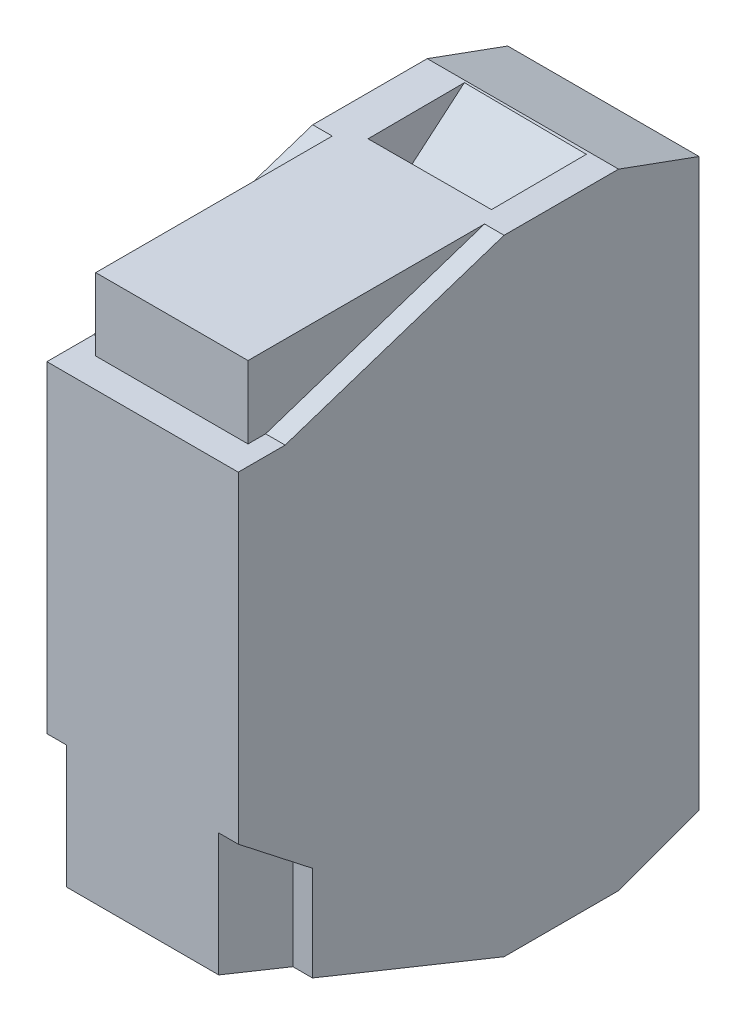
ISO-10303-21;
HEADER;
FILE_DESCRIPTION(('STEP AP214'),'2;1');
FILE_NAME('part.step','',(''),(''),'','','');
FILE_SCHEMA(('AUTOMOTIVE_DESIGN { 1 0 10303 214 1 1 1 1 }'));
ENDSEC;
DATA;
#1=APPLICATION_CONTEXT('core data for automotive mechanical design processes');
#2=APPLICATION_PROTOCOL_DEFINITION('international standard','automotive_design',2000,#1);
#3=PRODUCT_CONTEXT('',#1,'mechanical');
#4=PRODUCT('Part','Part','',(#3));
#5=PRODUCT_RELATED_PRODUCT_CATEGORY('part','',(#4));
#6=PRODUCT_DEFINITION_FORMATION('','',#4);
#7=PRODUCT_DEFINITION_CONTEXT('part definition',#1,'design');
#8=PRODUCT_DEFINITION('design','',#6,#7);
#9=PRODUCT_DEFINITION_SHAPE('','',#8);
#10=(LENGTH_UNIT() NAMED_UNIT(*) SI_UNIT(.MILLI.,.METRE.));
#11=(NAMED_UNIT(*) PLANE_ANGLE_UNIT() SI_UNIT($,.RADIAN.));
#12=(NAMED_UNIT(*) SI_UNIT($,.STERADIAN.) SOLID_ANGLE_UNIT());
#13=UNCERTAINTY_MEASURE_WITH_UNIT(LENGTH_MEASURE(1.E-05),#10,'distance_accuracy_value','');
#14=(GEOMETRIC_REPRESENTATION_CONTEXT(3) GLOBAL_UNCERTAINTY_ASSIGNED_CONTEXT((#13)) GLOBAL_UNIT_ASSIGNED_CONTEXT((#10,
#11,#12)) REPRESENTATION_CONTEXT('',''));
#15=CARTESIAN_POINT('',(0.,0.,0.));
#16=DIRECTION('',(0.,0.,1.));
#17=DIRECTION('',(1.,0.,0.));
#18=AXIS2_PLACEMENT_3D('',#15,#16,#17);
#19=CARTESIAN_POINT('',(-12.775,-14.5187608579998,-13.9946766695134));
#20=DIRECTION('',(0.0158897882345265,0.952019244493626,0.305625379743972));
#21=DIRECTION('',(0.,-0.3056639700203,0.952139452722882));
#22=AXIS2_PLACEMENT_3D('',#19,#20,#21);
#23=PLANE('',#22);
#24=DIRECTION('',(0.,0.305663970020264,-0.952139452722894));
#25=VECTOR('',#24,1.);
#26=CARTESIAN_POINT('',(-12.775,-14.5187608579998,-13.9946766695134));
#27=LINE('',#26,#25);
#28=CARTESIAN_POINT('',(-12.775,-14.5187608579998,-13.9946766695134));
#29=VERTEX_POINT('',#28);
#30=CARTESIAN_POINT('',(-12.775,-13.7192143055118,-16.485254204255));
#31=VERTEX_POINT('',#30);
#32=EDGE_CURVE('E252',#29,#31,#27,.T.);
#33=ORIENTED_EDGE('',*,*,#32,.T.);
#34=DIRECTION('',(0.999873749345317,-0.0151292942734967,-0.00485693575454399));
#35=VECTOR('',#34,1.);
#36=CARTESIAN_POINT('',(-12.775,-13.7192143055118,-16.485254204255));
#37=LINE('',#36,#35);
#38=CARTESIAN_POINT('',(-6.475,-13.8145408944791,-16.5158567631017));
#39=VERTEX_POINT('',#38);
#40=EDGE_CURVE('E267',#31,#39,#37,.T.);
#41=ORIENTED_EDGE('',*,*,#40,.T.);
#42=DIRECTION('',(0.,-0.305663970020309,0.952139452722879));
#43=VECTOR('',#42,1.);
#44=CARTESIAN_POINT('',(-6.475,-13.8145408944791,-16.5158567631017));
#45=LINE('',#44,#43);
#46=CARTESIAN_POINT('',(-6.475,-14.6140874469672,-14.0252792283602));
#47=VERTEX_POINT('',#46);
#48=EDGE_CURVE('E272',#39,#47,#45,.T.);
#49=ORIENTED_EDGE('',*,*,#48,.T.);
#50=DIRECTION('',(-0.999873749345317,0.0151292942735146,0.00485693575454812));
#51=VECTOR('',#50,1.);
#52=CARTESIAN_POINT('',(-6.475,-14.6140874469672,-14.0252792283601));
#53=LINE('',#52,#51);
#54=EDGE_CURVE('E192',#47,#29,#53,.T.);
#55=ORIENTED_EDGE('',*,*,#54,.T.);
#56=EDGE_LOOP('',(#33,#41,#49,#55));
#57=FACE_BOUND('',#56,.T.);
#58=ADVANCED_FACE('F17',(#57),#23,.F.);
#59=CARTESIAN_POINT('',(-9.9749172697154,8.82983200687334,-21.0854632939571));
#60=DIRECTION('',(-0.0151772161977119,-0.192360574077372,-0.981206941296846));
#61=DIRECTION('',(0.,0.981319970299247,-0.192382732831937));
#62=AXIS2_PLACEMENT_3D('',#59,#60,#61);
#63=PLANE('',#62);
#64=CARTESIAN_POINT('',(-9.97491726971537,8.82983200687334,-21.0854632939571));
#65=DIRECTION('',(-0.0151772161977118,-0.192360574077372,-0.981206941296846));
#66=DIRECTION('',(0.,0.981319970299247,-0.192382732831937));
#67=AXIS2_PLACEMENT_3D('',#64,#65,#66);
#68=CIRCLE('',#67,3.00044092043877);
#69=CARTESIAN_POINT('',(-9.97491726971537,11.774224601803,-21.6626963179319));
#70=VERTEX_POINT('',#69);
#71=EDGE_CURVE('E20',#70,#70,#68,.T.);
#72=ORIENTED_EDGE('',*,*,#71,.T.);
#73=EDGE_LOOP('',(#72));
#74=FACE_BOUND('',#73,.T.);
#75=ADVANCED_FACE('F812',(#74),#63,.T.);
#76=CARTESIAN_POINT('',(-9.97500000000195,-9.25392202739991,-18.6797311698814));
#77=DIRECTION('',(0.,0.173648177666921,-0.98480775301221));
#78=DIRECTION('',(0.,0.98480775301221,0.173648177666921));
#79=AXIS2_PLACEMENT_3D('',#76,#77,#78);
#80=PLANE('',#79);
#81=CARTESIAN_POINT('',(-9.97500000000195,-9.25392202739992,-18.6797311698814));
#82=DIRECTION('',(0.,0.173648177666921,-0.98480775301221));
#83=DIRECTION('',(0.,0.98480775301221,0.173648177666921));
#84=AXIS2_PLACEMENT_3D('',#81,#82,#83);
#85=CIRCLE('',#84,3.00000000000196);
#86=CARTESIAN_POINT('',(-9.97500000000195,-6.29949876836136,-18.1587866368803));
#87=VERTEX_POINT('',#86);
#88=EDGE_CURVE('E239',#87,#87,#85,.T.);
#89=ORIENTED_EDGE('',*,*,#88,.T.);
#90=EDGE_LOOP('',(#89));
#91=FACE_BOUND('',#90,.T.);
#92=ADVANCED_FACE('F803',(#91),#80,.T.);
#93=CARTESIAN_POINT('',(-6.07499999999921,-4.2,0.));
#94=DIRECTION('',(0.,0.788010753606377,-0.6156614753261));
#95=DIRECTION('',(0.,0.6156614753261,0.788010753606377));
#96=AXIS2_PLACEMENT_3D('',#93,#94,#95);
#97=PLANE('',#96);
#98=DIRECTION('',(1.,0.,0.));
#99=VECTOR('',#98,1.);
#100=CARTESIAN_POINT('',(-6.07499999999921,-4.2,0.));
#101=LINE('',#100,#99);
#102=CARTESIAN_POINT('',(-6.07499999999921,-4.2,0.));
#103=VERTEX_POINT('',#102);
#104=CARTESIAN_POINT('',(-5.0749999999994,-4.20000000000001,0.));
#105=VERTEX_POINT('',#104);
#106=EDGE_CURVE('E221',#103,#105,#101,.T.);
#107=ORIENTED_EDGE('',*,*,#106,.F.);
#108=DIRECTION('',(0.,-0.6156614753261,-0.788010753606377));
#109=VECTOR('',#108,1.);
#110=CARTESIAN_POINT('',(-6.07499999999921,-4.2,0.));
#111=LINE('',#110,#109);
#112=CARTESIAN_POINT('',(-6.07499999999921,-7.16888538072824,-3.7999999999991));
#113=VERTEX_POINT('',#112);
#114=EDGE_CURVE('E216',#103,#113,#111,.T.);
#115=ORIENTED_EDGE('',*,*,#114,.T.);
#116=DIRECTION('',(1.,0.,0.));
#117=VECTOR('',#116,1.);
#118=CARTESIAN_POINT('',(-6.07499999999921,-7.16888538072824,-3.7999999999991));
#119=LINE('',#118,#117);
#120=CARTESIAN_POINT('',(-5.0749999999996,-7.16888538072824,-3.7999999999991));
#121=VERTEX_POINT('',#120);
#122=EDGE_CURVE('E199',#113,#121,#119,.T.);
#123=ORIENTED_EDGE('',*,*,#122,.T.);
#124=DIRECTION('',(0.,-0.615661475326099,-0.788010753606377));
#125=VECTOR('',#124,1.);
#126=CARTESIAN_POINT('',(-5.07499999999999,-4.2,0.));
#127=LINE('',#126,#125);
#128=EDGE_CURVE('E245',#105,#121,#127,.T.);
#129=ORIENTED_EDGE('',*,*,#128,.F.);
#130=EDGE_LOOP('',(#107,#115,#123,#129));
#131=FACE_BOUND('',#130,.T.);
#132=ADVANCED_FACE('F220',(#131),#97,.F.);
#133=CARTESIAN_POINT('',(-6.07499999999921,-7.16888538072824,-3.7999999999991));
#134=DIRECTION('',(0.,1.880270448409E-13,-1.));
#135=DIRECTION('',(0.,1.,1.880270448409E-13));
#136=AXIS2_PLACEMENT_3D('',#133,#134,#135);
#137=PLANE('',#136);
#138=ORIENTED_EDGE('',*,*,#122,.F.);
#139=DIRECTION('',(0.,-1.,0.));
#140=VECTOR('',#139,1.);
#141=CARTESIAN_POINT('',(-6.07499999999921,-10.5,-3.7999999999991));
#142=LINE('',#141,#140);
#143=CARTESIAN_POINT('',(-6.07499999999921,-12.0352996581708,-3.79999999999942));
#144=VERTEX_POINT('',#143);
#145=EDGE_CURVE('E202',#113,#144,#142,.T.);
#146=ORIENTED_EDGE('',*,*,#145,.T.);
#147=DIRECTION('',(1.,0.,0.));
#148=VECTOR('',#147,1.);
#149=CARTESIAN_POINT('',(-6.07499999999921,-12.03529965817,-3.80000000000001));
#150=LINE('',#149,#148);
#151=CARTESIAN_POINT('',(-5.07499999999999,-12.0352996581708,-3.79999999999942));
#152=VERTEX_POINT('',#151);
#153=EDGE_CURVE('E210',#152,#144,#150,.F.);
#154=ORIENTED_EDGE('',*,*,#153,.F.);
#155=DIRECTION('',(0.,1.,0.));
#156=VECTOR('',#155,1.);
#157=CARTESIAN_POINT('',(-5.07499999999999,-15.999999999999,-3.7999999999991));
#158=LINE('',#157,#156);
#159=EDGE_CURVE('E205',#121,#152,#158,.F.);
#160=ORIENTED_EDGE('',*,*,#159,.F.);
#161=EDGE_LOOP('',(#138,#146,#154,#160));
#162=FACE_BOUND('',#161,.T.);
#163=ADVANCED_FACE('F201',(#162),#137,.F.);
#164=CARTESIAN_POINT('',(-6.07499999999997,16.,-13.61297769379));
#165=DIRECTION('',(0.,-0.949635772295845,-0.313355867945815));
#166=DIRECTION('',(0.,0.313355867945815,-0.949635772295845));
#167=AXIS2_PLACEMENT_3D('',#164,#165,#166);
#168=PLANE('',#167);
#169=DIRECTION('',(1.,0.,0.));
#170=VECTOR('',#169,1.);
#171=CARTESIAN_POINT('',(-6.07499999999997,16.,-13.61297769379));
#172=LINE('',#171,#170);
#173=CARTESIAN_POINT('',(-6.07499999999997,16.,-13.61297769379));
#174=VERTEX_POINT('',#173);
#175=CARTESIAN_POINT('',(-5.07499999999999,16.,-13.61297769379));
#176=VERTEX_POINT('',#175);
#177=EDGE_CURVE('E222',#174,#176,#172,.T.);
#178=ORIENTED_EDGE('',*,*,#177,.F.);
#179=DIRECTION('',(0.,-0.313355867945815,0.949635772295845));
#180=VECTOR('',#179,1.);
#181=CARTESIAN_POINT('',(-6.07499999999997,16.,-13.61297769379));
#182=LINE('',#181,#180);
#183=CARTESIAN_POINT('',(-6.07499999999997,12.3,-2.40000000000001));
#184=VERTEX_POINT('',#183);
#185=EDGE_CURVE('E352',#174,#184,#182,.T.);
#186=ORIENTED_EDGE('',*,*,#185,.T.);
#187=DIRECTION('',(1.,0.,0.));
#188=VECTOR('',#187,1.);
#189=CARTESIAN_POINT('',(-6.07499999999997,12.3,-2.40000000000001));
#190=LINE('',#189,#188);
#191=CARTESIAN_POINT('',(-5.07499999999999,12.3,-2.40000000000001));
#192=VERTEX_POINT('',#191);
#193=EDGE_CURVE('E209',#192,#184,#190,.F.);
#194=ORIENTED_EDGE('',*,*,#193,.F.);
#195=DIRECTION('',(0.,-0.313355867945815,0.949635772295844));
#196=VECTOR('',#195,1.);
#197=CARTESIAN_POINT('',(-5.07499999999999,16.,-13.61297769379));
#198=LINE('',#197,#196);
#199=EDGE_CURVE('E241',#176,#192,#198,.T.);
#200=ORIENTED_EDGE('',*,*,#199,.F.);
#201=EDGE_LOOP('',(#178,#186,#194,#200));
#202=FACE_BOUND('',#201,.T.);
#203=ADVANCED_FACE('F776',(#202),#168,.F.);
#204=CARTESIAN_POINT('',(-6.51130572205648,13.6632800916336,-16.4178370831687));
#205=DIRECTION('',(-0.0158451955719152,0.926463785138677,-0.376050242127038));
#206=DIRECTION('',(0.,0.376097458527219,0.926580110777998));
#207=AXIS2_PLACEMENT_3D('',#204,#205,#206);
#208=PLANE('',#207);
#209=DIRECTION('',(0.999871517693045,0.0137698617012083,-0.00820603527508992));
#210=VECTOR('',#209,1.);
#211=CARTESIAN_POINT('',(-12.8085506932593,13.5679951895707,-16.3872479070094));
#212=LINE('',#211,#210);
#213=CARTESIAN_POINT('',(-12.8085506932593,13.5679951895706,-16.3872479070094));
#214=VERTEX_POINT('',#213);
#215=CARTESIAN_POINT('',(-6.50852360099894,13.6547568386818,-16.4389527947257));
#216=VERTEX_POINT('',#215);
#217=EDGE_CURVE('E342',#214,#216,#212,.T.);
#218=ORIENTED_EDGE('',*,*,#217,.F.);
#219=DIRECTION('',(0.00118959969142993,-0.376079724634701,-0.926586545105886));
#220=VECTOR('',#219,1.);
#221=CARTESIAN_POINT('',(-12.8113057220565,14.4389692482193,-14.2413389653241));
#222=LINE('',#221,#220);
#223=CARTESIAN_POINT('',(-12.8113057220565,14.4389692482193,-14.2413389653241));
#224=VERTEX_POINT('',#223);
#225=EDGE_CURVE('E347',#224,#214,#222,.T.);
#226=ORIENTED_EDGE('',*,*,#225,.F.);
#227=DIRECTION('',(-0.999873749345317,-0.0151292942735129,0.00485693575454783));
#228=VECTOR('',#227,1.);
#229=CARTESIAN_POINT('',(-6.51130572205648,14.5342958371867,-14.2719415241708));
#230=LINE('',#229,#228);
#231=CARTESIAN_POINT('',(-6.51130572205648,14.5342958371867,-14.2719415241708));
#232=VERTEX_POINT('',#231);
#233=EDGE_CURVE('E329',#232,#224,#230,.T.);
#234=ORIENTED_EDGE('',*,*,#233,.F.);
#235=DIRECTION('',(-0.00118959969142935,0.376079724634689,0.926586545105891));
#236=VECTOR('',#235,1.);
#237=CARTESIAN_POINT('',(-6.50852360099894,13.6547568386818,-16.4389527947257));
#238=LINE('',#237,#236);
#239=EDGE_CURVE('E337',#216,#232,#238,.T.);
#240=ORIENTED_EDGE('',*,*,#239,.F.);
#241=EDGE_LOOP('',(#218,#226,#234,#240));
#242=FACE_BOUND('',#241,.T.);
#243=ADVANCED_FACE('F767',(#242),#208,.T.);
#244=CARTESIAN_POINT('',(-6.07499999999921,-10.5,0.));
#245=DIRECTION('',(-1.,0.,0.));
#246=DIRECTION('',(0.,-1.,0.));
#247=AXIS2_PLACEMENT_3D('',#244,#245,#246);
#248=PLANE('',#247);
#249=DIRECTION('',(0.,-0.374606593416023,-0.927183854566743));
#250=VECTOR('',#249,1.);
#251=CARTESIAN_POINT('',(-6.07499999999921,-16.0000000000018,-13.6129776937893));
#252=LINE('',#251,#250);
#253=CARTESIAN_POINT('',(-6.07499999999921,-10.5,0.));
#254=VERTEX_POINT('',#253);
#255=EDGE_CURVE('E218',#144,#254,#252,.F.);
#256=ORIENTED_EDGE('',*,*,#255,.F.);
#257=ORIENTED_EDGE('',*,*,#145,.F.);
#258=ORIENTED_EDGE('',*,*,#114,.F.);
#259=DIRECTION('',(0.,-1.,0.));
#260=VECTOR('',#259,1.);
#261=CARTESIAN_POINT('',(-6.07499999999921,-10.5,0.));
#262=LINE('',#261,#260);
#263=EDGE_CURVE('E315',#254,#103,#262,.F.);
#264=ORIENTED_EDGE('',*,*,#263,.F.);
#265=EDGE_LOOP('',(#256,#257,#258,#264));
#266=FACE_BOUND('',#265,.T.);
#267=ADVANCED_FACE('F214',(#266),#248,.F.);
#268=CARTESIAN_POINT('',(-13.8750000000008,-10.5,0.));
#269=DIRECTION('',(-1.,0.,0.));
#270=DIRECTION('',(0.,-1.,0.));
#271=AXIS2_PLACEMENT_3D('',#268,#269,#270);
#272=PLANE('',#271);
#273=DIRECTION('',(0.,-1.,0.));
#274=VECTOR('',#273,1.);
#275=CARTESIAN_POINT('',(-13.8750000000008,-7.16888538072824,-3.7999999999991));
#276=LINE('',#275,#274);
#277=CARTESIAN_POINT('',(-13.8750000000008,-12.0352996581716,-3.79999999999897));
#278=VERTEX_POINT('',#277);
#279=CARTESIAN_POINT('',(-13.8750000000008,-7.16888538072824,-3.7999999999991));
#280=VERTEX_POINT('',#279);
#281=EDGE_CURVE('E303',#278,#280,#276,.F.);
#282=ORIENTED_EDGE('',*,*,#281,.F.);
#283=DIRECTION('',(0.,-0.374606593416023,-0.927183854566743));
#284=VECTOR('',#283,1.);
#285=CARTESIAN_POINT('',(-13.8750000000008,-16.0000000000018,-13.6129776937893));
#286=LINE('',#285,#284);
#287=CARTESIAN_POINT('',(-13.8750000000008,-10.5,0.));
#288=VERTEX_POINT('',#287);
#289=EDGE_CURVE('E295',#288,#278,#286,.T.);
#290=ORIENTED_EDGE('',*,*,#289,.F.);
#291=DIRECTION('',(0.,-1.,0.));
#292=VECTOR('',#291,1.);
#293=CARTESIAN_POINT('',(-13.8750000000008,-10.5,0.));
#294=LINE('',#293,#292);
#295=CARTESIAN_POINT('',(-13.8750000000008,-4.2,0.));
#296=VERTEX_POINT('',#295);
#297=EDGE_CURVE('E309',#296,#288,#294,.T.);
#298=ORIENTED_EDGE('',*,*,#297,.F.);
#299=DIRECTION('',(0.,-0.6156614753261,-0.788010753606377));
#300=VECTOR('',#299,1.);
#301=CARTESIAN_POINT('',(-13.8750000000008,-4.2,0.));
#302=LINE('',#301,#300);
#303=EDGE_CURVE('E307',#280,#296,#302,.F.);
#304=ORIENTED_EDGE('',*,*,#303,.F.);
#305=EDGE_LOOP('',(#282,#290,#298,#304));
#306=FACE_BOUND('',#305,.T.);
#307=ADVANCED_FACE('F375',(#306),#272,.T.);
#308=CARTESIAN_POINT('',(-12.775,-14.5187608579998,-13.9946766695134));
#309=DIRECTION('',(0.00322994020393923,-0.105764120238685,0.994386000684048));
#310=DIRECTION('',(0.,-0.994391187697432,-0.105764671935819));
#311=AXIS2_PLACEMENT_3D('',#308,#309,#310);
#312=PLANE('',#311);
#313=DIRECTION('',(0.0155580479629378,0.994276146412516,0.105701900733432));
#314=VECTOR('',#313,1.);
#315=CARTESIAN_POINT('',(-12.7981778562716,-16.0000000000016,-14.1521478039817));
#316=LINE('',#315,#314);
#317=CARTESIAN_POINT('',(-12.7981778562716,-16.0000000000016,-14.1521478039817));
#318=VERTEX_POINT('',#317);
#319=EDGE_CURVE('E259',#318,#29,#316,.T.);
#320=ORIENTED_EDGE('',*,*,#319,.T.);
#321=ORIENTED_EDGE('',*,*,#54,.F.);
#322=DIRECTION('',(-0.0155580479629373,-0.994276146412522,-0.105701900733376));
#323=VECTOR('',#322,1.);
#324=CARTESIAN_POINT('',(-6.475,-14.6140874469672,-14.0252792283602));
#325=LINE('',#324,#323);
#326=CARTESIAN_POINT('',(-6.49668622273636,-16.0000000000016,-14.1726161544592));
#327=VERTEX_POINT('',#326);
#328=EDGE_CURVE('E270',#47,#327,#325,.T.);
#329=ORIENTED_EDGE('',*,*,#328,.T.);
#330=DIRECTION('',(0.999994724719838,0.,-0.00324815832370377));
#331=VECTOR('',#330,1.);
#332=CARTESIAN_POINT('',(-12.7981778562716,-16.0000000000017,-14.1521478039817));
#333=LINE('',#332,#331);
#334=EDGE_CURVE('E281',#318,#327,#333,.T.);
#335=ORIENTED_EDGE('',*,*,#334,.F.);
#336=EDGE_LOOP('',(#320,#321,#329,#335));
#337=FACE_BOUND('',#336,.T.);
#338=ADVANCED_FACE('F280',(#337),#312,.F.);
#339=CARTESIAN_POINT('',(-6.475,-14.6140874469672,-14.0252792283602));
#340=DIRECTION('',(0.999873749345317,-0.0151292942735043,-0.00485693575454711));
#341=DIRECTION('',(0.0151294727253631,0.999885542977321,0.));
#342=AXIS2_PLACEMENT_3D('',#339,#340,#341);
#343=PLANE('',#342);
#344=ORIENTED_EDGE('',*,*,#328,.F.);
#345=ORIENTED_EDGE('',*,*,#48,.F.);
#346=DIRECTION('',(-0.0157999380236707,-0.914176235261129,-0.405008855263977));
#347=VECTOR('',#346,1.);
#348=CARTESIAN_POINT('',(-6.475,-13.8145408944791,-16.5158567631017));
#349=LINE('',#348,#347);
#350=CARTESIAN_POINT('',(-6.51277183992389,-16.0000000000007,-17.4840839565167));
#351=VERTEX_POINT('',#350);
#352=EDGE_CURVE('E264',#39,#351,#349,.T.);
#353=ORIENTED_EDGE('',*,*,#352,.T.);
#354=DIRECTION('',(-0.00485749171546556,2.72400524255366E-13,-0.999988202317524));
#355=VECTOR('',#354,1.);
#356=CARTESIAN_POINT('',(-6.49668622273636,-16.0000000000016,-14.1726161544592));
#357=LINE('',#356,#355);
#358=EDGE_CURVE('E284',#327,#351,#357,.T.);
#359=ORIENTED_EDGE('',*,*,#358,.F.);
#360=EDGE_LOOP('',(#344,#345,#353,#359));
#361=FACE_BOUND('',#360,.T.);
#362=ADVANCED_FACE('F453',(#361),#343,.F.);
#363=CARTESIAN_POINT('',(-6.475,-13.8145408944791,-16.5158567631017));
#364=DIRECTION('',(0.00168740291166665,0.405034461914754,-0.914299861824795));
#365=DIRECTION('',(0.,0.914301163483641,0.405035038549086));
#366=AXIS2_PLACEMENT_3D('',#363,#364,#365);
#367=PLANE('',#366);
#368=ORIENTED_EDGE('',*,*,#352,.F.);
#369=ORIENTED_EDGE('',*,*,#40,.F.);
#370=DIRECTION('',(-0.0157999380236697,-0.914176235261137,-0.405008855263959));
#371=VECTOR('',#370,1.);
#372=CARTESIAN_POINT('',(-12.775,-13.7192143055118,-16.485254204255));
#373=LINE('',#372,#371);
#374=CARTESIAN_POINT('',(-12.8144193933601,-16.0000000000007,-17.4957140779614));
#375=VERTEX_POINT('',#374);
#376=EDGE_CURVE('E248',#31,#375,#373,.T.);
#377=ORIENTED_EDGE('',*,*,#376,.T.);
#378=DIRECTION('',(-0.999998296943034,0.,-0.00184556523342836));
#379=VECTOR('',#378,1.);
#380=CARTESIAN_POINT('',(-6.51277183992389,-16.0000000000007,-17.4840839565167));
#381=LINE('',#380,#379);
#382=EDGE_CURVE('E287',#351,#375,#381,.T.);
#383=ORIENTED_EDGE('',*,*,#382,.F.);
#384=EDGE_LOOP('',(#368,#369,#377,#383));
#385=FACE_BOUND('',#384,.T.);
#386=ADVANCED_FACE('F451',(#385),#367,.F.);
#387=CARTESIAN_POINT('',(-12.775,-13.7192143055118,-16.485254204255));
#388=DIRECTION('',(-0.999873749345317,0.0151292942735047,0.00485693575454723));
#389=DIRECTION('',(-0.0151294727253635,-0.999885542977321,0.));
#390=AXIS2_PLACEMENT_3D('',#387,#388,#389);
#391=PLANE('',#390);
#392=ORIENTED_EDGE('',*,*,#376,.F.);
#393=ORIENTED_EDGE('',*,*,#32,.F.);
#394=ORIENTED_EDGE('',*,*,#319,.F.);
#395=DIRECTION('',(0.004857491715476,-2.7289836917476E-13,0.999988202317524));
#396=VECTOR('',#395,1.);
#397=CARTESIAN_POINT('',(-12.8144193933601,-16.0000000000007,-17.4957140779614));
#398=LINE('',#397,#396);
#399=EDGE_CURVE('E448',#375,#318,#398,.T.);
#400=ORIENTED_EDGE('',*,*,#399,.F.);
#401=EDGE_LOOP('',(#392,#393,#394,#400));
#402=FACE_BOUND('',#401,.T.);
#403=ADVANCED_FACE('F277',(#402),#391,.F.);
#404=CARTESIAN_POINT('',(-10.1950878496999,6.0393242741603,-35.3194900440501));
#405=DIRECTION('',(-0.0151772161977118,-0.192360574077372,-0.981206941296846));
#406=DIRECTION('',(0.,0.981319970299247,-0.192382732831937));
#407=AXIS2_PLACEMENT_3D('',#404,#405,#406);
#408=CYLINDRICAL_SURFACE('',#407,3.00044092043877);
#409=CARTESIAN_POINT('',(-10.0138118857423,8.33687001898347,-23.6));
#410=DIRECTION('',(0.,0.,-1.));
#411=DIRECTION('',(-0.0786553856981132,-0.996901865932992,0.));
#412=AXIS2_PLACEMENT_3D('',#409,#410,#411);
#413=ELLIPSE('',#412,3.0579083719823,3.00044092043877);
#414=CARTESIAN_POINT('',(-10.2543328481701,5.2884354571022,-23.6));
#415=VERTEX_POINT('',#414);
#416=EDGE_CURVE('E235',#415,#415,#413,.F.);
#417=ORIENTED_EDGE('',*,*,#416,.F.);
#418=EDGE_LOOP('',(#417));
#419=FACE_BOUND('',#418,.T.);
#420=ORIENTED_EDGE('',*,*,#71,.F.);
#421=EDGE_LOOP('',(#420));
#422=FACE_BOUND('',#421,.T.);
#423=ADVANCED_FACE('F537',(#419,#422),#408,.F.);
#424=CARTESIAN_POINT('',(-9.97500000000162,-6.12838044886675,-36.4055583006768));
#425=DIRECTION('',(0.,0.173648177666921,-0.98480775301221));
#426=DIRECTION('',(0.,0.98480775301221,0.173648177666921));
#427=AXIS2_PLACEMENT_3D('',#424,#425,#426);
#428=CYLINDRICAL_SURFACE('',#427,3.00000000000196);
#429=ORIENTED_EDGE('',*,*,#88,.F.);
#430=EDGE_LOOP('',(#429));
#431=FACE_BOUND('',#430,.T.);
#432=CARTESIAN_POINT('',(-9.97500000000186,-8.38634588031118,-23.6));
#433=DIRECTION('',(0.,0.,-1.));
#434=DIRECTION('',(1.13032754680339E-13,1.,0.));
#435=AXIS2_PLACEMENT_3D('',#432,#433,#434);
#436=ELLIPSE('',#435,3.04627983565922,3.00000000000196);
#437=CARTESIAN_POINT('',(-9.97500000000152,-5.34006604465196,-23.6));
#438=VERTEX_POINT('',#437);
#439=EDGE_CURVE('E230',#438,#438,#436,.F.);
#440=ORIENTED_EDGE('',*,*,#439,.F.);
#441=EDGE_LOOP('',(#440));
#442=FACE_BOUND('',#441,.T.);
#443=ADVANCED_FACE('F534',(#431,#442),#428,.F.);
#444=CARTESIAN_POINT('',(-5.07499999999999,-15.999999999999,-23.6));
#445=DIRECTION('',(1.,0.,0.));
#446=DIRECTION('',(0.,1.,0.));
#447=AXIS2_PLACEMENT_3D('',#444,#445,#446);
#448=PLANE('',#447);
#449=DIRECTION('',(0.,0.342020143325664,0.93969262078591));
#450=VECTOR('',#449,1.);
#451=CARTESIAN_POINT('',(-5.07499999999999,16.,-19.478783870818));
#452=LINE('',#451,#450);
#453=CARTESIAN_POINT('',(-5.07499999999999,16.,-19.478783870818));
#454=VERTEX_POINT('',#453);
#455=CARTESIAN_POINT('',(-5.07499999999999,14.5,-23.6));
#456=VERTEX_POINT('',#455);
#457=EDGE_CURVE('E233',#454,#456,#452,.F.);
#458=ORIENTED_EDGE('',*,*,#457,.F.);
#459=DIRECTION('',(0.,0.,1.));
#460=VECTOR('',#459,1.);
#461=CARTESIAN_POINT('',(-5.07499999999999,16.,-19.3102796770641));
#462=LINE('',#461,#460);
#463=EDGE_CURVE('E434',#176,#454,#462,.F.);
#464=ORIENTED_EDGE('',*,*,#463,.F.);
#465=ORIENTED_EDGE('',*,*,#199,.T.);
#466=DIRECTION('',(0.,0.,1.));
#467=VECTOR('',#466,1.);
#468=CARTESIAN_POINT('',(-5.07499999999999,12.3,0.));
#469=LINE('',#468,#467);
#470=CARTESIAN_POINT('',(-5.0749999999998,12.3,0.));
#471=VERTEX_POINT('',#470);
#472=EDGE_CURVE('E317',#471,#192,#469,.F.);
#473=ORIENTED_EDGE('',*,*,#472,.F.);
#474=DIRECTION('',(0.,-1.,0.));
#475=VECTOR('',#474,1.);
#476=CARTESIAN_POINT('',(-5.07499999999921,-10.5,0.));
#477=LINE('',#476,#475);
#478=EDGE_CURVE('E313',#105,#471,#477,.F.);
#479=ORIENTED_EDGE('',*,*,#478,.F.);
#480=ORIENTED_EDGE('',*,*,#128,.T.);
#481=ORIENTED_EDGE('',*,*,#159,.T.);
#482=DIRECTION('',(0.,-0.374606593416023,-0.927183854566743));
#483=VECTOR('',#482,1.);
#484=CARTESIAN_POINT('',(-5.07499999999999,-16.0000000000018,-13.6129776937893));
#485=LINE('',#484,#483);
#486=CARTESIAN_POINT('',(-5.07499999999999,-16.0000000000018,-13.6129776937893));
#487=VERTEX_POINT('',#486);
#488=EDGE_CURVE('E285',#487,#152,#485,.F.);
#489=ORIENTED_EDGE('',*,*,#488,.F.);
#490=DIRECTION('',(0.,2.72827205890148E-13,-1.));
#491=VECTOR('',#490,1.);
#492=CARTESIAN_POINT('',(-5.07499999999999,-16.0000000000002,-19.4787838708181));
#493=LINE('',#492,#491);
#494=CARTESIAN_POINT('',(-5.07499999999999,-16.000000000001,-19.4787838708159));
#495=VERTEX_POINT('',#494);
#496=EDGE_CURVE('E446',#495,#487,#493,.F.);
#497=ORIENTED_EDGE('',*,*,#496,.F.);
#498=DIRECTION('',(0.,0.342020143325699,-0.939692620785897));
#499=VECTOR('',#498,1.);
#500=CARTESIAN_POINT('',(-5.07499999999999,-14.5,-23.6));
#501=LINE('',#500,#499);
#502=CARTESIAN_POINT('',(-5.07499999999999,-14.5,-23.6));
#503=VERTEX_POINT('',#502);
#504=EDGE_CURVE('E442',#503,#495,#501,.F.);
#505=ORIENTED_EDGE('',*,*,#504,.F.);
#506=DIRECTION('',(0.,1.,0.));
#507=VECTOR('',#506,1.);
#508=CARTESIAN_POINT('',(-5.07499999999999,14.5,-23.6));
#509=LINE('',#508,#507);
#510=EDGE_CURVE('E237',#456,#503,#509,.F.);
#511=ORIENTED_EDGE('',*,*,#510,.F.);
#512=EDGE_LOOP('',(#458,#464,#465,#473,#479,#480,#481,#489,#497,#505,#511));
#513=FACE_BOUND('',#512,.T.);
#514=ADVANCED_FACE('F358',(#513),#448,.T.);
#515=CARTESIAN_POINT('',(-14.875,12.3,-1.5));
#516=DIRECTION('',(0.,0.,1.));
#517=DIRECTION('',(0.,-1.,0.));
#518=AXIS2_PLACEMENT_3D('',#515,#516,#517);
#519=PLANE('',#518);
#520=DIRECTION('',(0.,-1.,0.));
#521=VECTOR('',#520,1.);
#522=CARTESIAN_POINT('',(-13.875,16.,-1.50000000000001));
#523=LINE('',#522,#521);
#524=CARTESIAN_POINT('',(-13.875,12.3,-1.50000000000001));
#525=VERTEX_POINT('',#524);
#526=CARTESIAN_POINT('',(-13.875,16.,-1.50000000000001));
#527=VERTEX_POINT('',#526);
#528=EDGE_CURVE('E327',#525,#527,#523,.F.);
#529=ORIENTED_EDGE('',*,*,#528,.F.);
#530=DIRECTION('',(1.,0.,0.));
#531=VECTOR('',#530,1.);
#532=CARTESIAN_POINT('',(-14.875,12.3,-1.50000000000001));
#533=LINE('',#532,#531);
#534=CARTESIAN_POINT('',(-6.07499999999997,12.3,-1.50000000000001));
#535=VERTEX_POINT('',#534);
#536=EDGE_CURVE('E322',#535,#525,#533,.F.);
#537=ORIENTED_EDGE('',*,*,#536,.F.);
#538=DIRECTION('',(0.,-1.,0.));
#539=VECTOR('',#538,1.);
#540=CARTESIAN_POINT('',(-6.07499999999997,16.,-1.50000000000001));
#541=LINE('',#540,#539);
#542=CARTESIAN_POINT('',(-6.07499999999997,16.,-1.5));
#543=VERTEX_POINT('',#542);
#544=EDGE_CURVE('E349',#535,#543,#541,.F.);
#545=ORIENTED_EDGE('',*,*,#544,.T.);
#546=DIRECTION('',(1.,0.,0.));
#547=VECTOR('',#546,1.);
#548=CARTESIAN_POINT('',(-6.5470715398258,16.,-1.5));
#549=LINE('',#548,#547);
#550=EDGE_CURVE('E427',#527,#543,#549,.T.);
#551=ORIENTED_EDGE('',*,*,#550,.F.);
#552=EDGE_LOOP('',(#529,#537,#545,#551));
#553=FACE_BOUND('',#552,.T.);
#554=ADVANCED_FACE('F527',(#553),#519,.T.);
#555=CARTESIAN_POINT('',(-6.07499999999997,16.,-13.61297769379));
#556=DIRECTION('',(-1.,0.,0.));
#557=DIRECTION('',(0.,-1.,0.));
#558=AXIS2_PLACEMENT_3D('',#555,#556,#557);
#559=PLANE('',#558);
#560=ORIENTED_EDGE('',*,*,#544,.F.);
#561=DIRECTION('',(0.,0.,1.));
#562=VECTOR('',#561,1.);
#563=CARTESIAN_POINT('',(-6.07499999999997,12.3,0.));
#564=LINE('',#563,#562);
#565=EDGE_CURVE('E324',#184,#535,#564,.T.);
#566=ORIENTED_EDGE('',*,*,#565,.F.);
#567=ORIENTED_EDGE('',*,*,#185,.F.);
#568=DIRECTION('',(0.,0.,1.));
#569=VECTOR('',#568,1.);
#570=CARTESIAN_POINT('',(-6.07499999999997,16.,-19.3102796770641));
#571=LINE('',#570,#569);
#572=EDGE_CURVE('E424',#543,#174,#571,.F.);
#573=ORIENTED_EDGE('',*,*,#572,.F.);
#574=EDGE_LOOP('',(#560,#566,#567,#573));
#575=FACE_BOUND('',#574,.T.);
#576=ADVANCED_FACE('F523',(#575),#559,.F.);
#577=CARTESIAN_POINT('',(-12.775,11.3192143055118,-16.485254204255));
#578=DIRECTION('',(0.999873749345317,0.0151292942735045,-0.00485693575454724));
#579=DIRECTION('',(-0.0151294727253633,0.999885542977321,0.));
#580=AXIS2_PLACEMENT_3D('',#577,#578,#579);
#581=PLANE('',#580);
#582=DIRECTION('',(-0.0155580479629455,0.994276146412516,-0.105701900733431));
#583=VECTOR('',#582,1.);
#584=CARTESIAN_POINT('',(-12.8113057220565,14.4389692482193,-14.241338965324));
#585=LINE('',#584,#583);
#586=CARTESIAN_POINT('',(-12.8357321265272,16.,-14.4072927782179));
#587=VERTEX_POINT('',#586);
#588=EDGE_CURVE('E335',#224,#587,#585,.T.);
#589=ORIENTED_EDGE('',*,*,#588,.F.);
#590=ORIENTED_EDGE('',*,*,#225,.T.);
#591=DIRECTION('',(0.0133326029503092,-0.632518681727296,0.77443034481129));
#592=VECTOR('',#591,1.);
#593=CARTESIAN_POINT('',(-12.8598139293461,16.,-19.364896438718));
#594=LINE('',#593,#592);
#595=CARTESIAN_POINT('',(-12.8598139293461,16.,-19.364896438718));
#596=VERTEX_POINT('',#595);
#597=EDGE_CURVE('E344',#596,#214,#594,.T.);
#598=ORIENTED_EDGE('',*,*,#597,.F.);
#599=DIRECTION('',(-0.00485749171546481,0.,-0.999988202317524));
#600=VECTOR('',#599,1.);
#601=CARTESIAN_POINT('',(-12.8357321265272,16.,-14.4072927782179));
#602=LINE('',#601,#600);
#603=EDGE_CURVE('E422',#587,#596,#602,.T.);
#604=ORIENTED_EDGE('',*,*,#603,.F.);
#605=EDGE_LOOP('',(#589,#590,#598,#604));
#606=FACE_BOUND('',#605,.T.);
#607=ADVANCED_FACE('F519',(#606),#581,.T.);
#608=CARTESIAN_POINT('',(-6.5470715398258,16.,-19.3102796770641));
#609=DIRECTION('',(-0.00547333635753639,0.774441416044772,0.632621953226162));
#610=DIRECTION('',(0.,-0.632631429296965,0.774453016435264));
#611=AXIS2_PLACEMENT_3D('',#608,#609,#610);
#612=PLANE('',#611);
#613=ORIENTED_EDGE('',*,*,#597,.T.);
#614=ORIENTED_EDGE('',*,*,#217,.T.);
#615=DIRECTION('',(0.0133326029503127,-0.632518681727287,0.774430344811297));
#616=VECTOR('',#615,1.);
#617=CARTESIAN_POINT('',(-6.5579580237205,16.,-19.3103738650508));
#618=LINE('',#617,#616);
#619=CARTESIAN_POINT('',(-6.5579580237205,16.,-19.3103738650508));
#620=VERTEX_POINT('',#619);
#621=EDGE_CURVE('E339',#620,#216,#618,.T.);
#622=ORIENTED_EDGE('',*,*,#621,.F.);
#623=DIRECTION('',(0.999962575036776,0.,0.00865150425182114));
#624=VECTOR('',#623,1.);
#625=CARTESIAN_POINT('',(-12.8598139293461,16.,-19.364896438718));
#626=LINE('',#625,#624);
#627=EDGE_CURVE('E420',#596,#620,#626,.T.);
#628=ORIENTED_EDGE('',*,*,#627,.F.);
#629=EDGE_LOOP('',(#613,#614,#622,#628));
#630=FACE_BOUND('',#629,.T.);
#631=ADVANCED_FACE('F515',(#630),#612,.T.);
#632=CARTESIAN_POINT('',(-6.475,12.2140874469672,-14.0252792283602));
#633=DIRECTION('',(-0.999873749345317,-0.0151292942735044,0.00485693575454721));
#634=DIRECTION('',(0.0151294727253632,-0.999885542977321,0.));
#635=AXIS2_PLACEMENT_3D('',#632,#633,#634);
#636=PLANE('',#635);
#637=ORIENTED_EDGE('',*,*,#621,.T.);
#638=ORIENTED_EDGE('',*,*,#239,.T.);
#639=DIRECTION('',(0.0155580479629419,-0.994276146412516,0.105701900733431));
#640=VECTOR('',#639,1.);
#641=CARTESIAN_POINT('',(-6.53424049299191,16.,-14.4277611286954));
#642=LINE('',#641,#640);
#643=CARTESIAN_POINT('',(-6.53424049299191,16.,-14.4277611286954));
#644=VERTEX_POINT('',#643);
#645=EDGE_CURVE('E332',#644,#232,#642,.T.);
#646=ORIENTED_EDGE('',*,*,#645,.F.);
#647=DIRECTION('',(0.00485749171546971,0.,0.999988202317524));
#648=VECTOR('',#647,1.);
#649=CARTESIAN_POINT('',(-6.5579580237205,16.,-19.3103738650508));
#650=LINE('',#649,#648);
#651=EDGE_CURVE('E418',#620,#644,#650,.T.);
#652=ORIENTED_EDGE('',*,*,#651,.F.);
#653=EDGE_LOOP('',(#637,#638,#646,#652));
#654=FACE_BOUND('',#653,.T.);
#655=ADVANCED_FACE('F511',(#654),#636,.T.);
#656=CARTESIAN_POINT('',(-12.775,12.1187608579998,-13.9946766695134));
#657=DIRECTION('',(-0.00322994020393919,-0.105764120238685,-0.994386000684048));
#658=DIRECTION('',(0.,0.994391187697432,-0.10576467193582));
#659=AXIS2_PLACEMENT_3D('',#656,#657,#658);
#660=PLANE('',#659);
#661=ORIENTED_EDGE('',*,*,#645,.T.);
#662=ORIENTED_EDGE('',*,*,#233,.T.);
#663=ORIENTED_EDGE('',*,*,#588,.T.);
#664=DIRECTION('',(-0.999994724719838,0.,0.00324815832370347));
#665=VECTOR('',#664,1.);
#666=CARTESIAN_POINT('',(-6.53424049299191,16.,-14.4277611286954));
#667=LINE('',#666,#665);
#668=EDGE_CURVE('E415',#644,#587,#667,.T.);
#669=ORIENTED_EDGE('',*,*,#668,.F.);
#670=EDGE_LOOP('',(#661,#662,#663,#669));
#671=FACE_BOUND('',#670,.T.);
#672=ADVANCED_FACE('F507',(#671),#660,.T.);
#673=CARTESIAN_POINT('',(-13.875,16.,-13.61297769379));
#674=DIRECTION('',(-1.,0.,0.));
#675=DIRECTION('',(0.,-1.,0.));
#676=AXIS2_PLACEMENT_3D('',#673,#674,#675);
#677=PLANE('',#676);
#678=DIRECTION('',(0.,-0.313355867945815,0.949635772295845));
#679=VECTOR('',#678,1.);
#680=CARTESIAN_POINT('',(-13.875,16.,-13.61297769379));
#681=LINE('',#680,#679);
#682=CARTESIAN_POINT('',(-13.875,12.3,-2.40000000000001));
#683=VERTEX_POINT('',#682);
#684=CARTESIAN_POINT('',(-13.875,16.,-13.61297769379));
#685=VERTEX_POINT('',#684);
#686=EDGE_CURVE('E410',#683,#685,#681,.F.);
#687=ORIENTED_EDGE('',*,*,#686,.F.);
#688=DIRECTION('',(0.,0.,1.));
#689=VECTOR('',#688,1.);
#690=CARTESIAN_POINT('',(-13.875,12.3,0.));
#691=LINE('',#690,#689);
#692=EDGE_CURVE('E320',#525,#683,#691,.F.);
#693=ORIENTED_EDGE('',*,*,#692,.F.);
#694=ORIENTED_EDGE('',*,*,#528,.T.);
#695=DIRECTION('',(0.,0.,1.));
#696=VECTOR('',#695,1.);
#697=CARTESIAN_POINT('',(-13.875,16.,-19.3102796770641));
#698=LINE('',#697,#696);
#699=EDGE_CURVE('E429',#685,#527,#698,.T.);
#700=ORIENTED_EDGE('',*,*,#699,.F.);
#701=EDGE_LOOP('',(#687,#693,#694,#700));
#702=FACE_BOUND('',#701,.T.);
#703=ADVANCED_FACE('F503',(#702),#677,.T.);
#704=CARTESIAN_POINT('',(-14.875,12.3,0.));
#705=DIRECTION('',(0.,1.,0.));
#706=DIRECTION('',(0.,0.,1.));
#707=AXIS2_PLACEMENT_3D('',#704,#705,#706);
#708=PLANE('',#707);
#709=DIRECTION('',(1.,0.,0.));
#710=VECTOR('',#709,1.);
#711=CARTESIAN_POINT('',(-14.875,12.3,0.));
#712=LINE('',#711,#710);
#713=CARTESIAN_POINT('',(-14.875,12.3,0.));
#714=VERTEX_POINT('',#713);
#715=EDGE_CURVE('E311',#471,#714,#712,.F.);
#716=ORIENTED_EDGE('',*,*,#715,.F.);
#717=ORIENTED_EDGE('',*,*,#472,.T.);
#718=ORIENTED_EDGE('',*,*,#193,.T.);
#719=ORIENTED_EDGE('',*,*,#565,.T.);
#720=ORIENTED_EDGE('',*,*,#536,.T.);
#721=ORIENTED_EDGE('',*,*,#692,.T.);
#722=DIRECTION('',(1.,0.,0.));
#723=VECTOR('',#722,1.);
#724=CARTESIAN_POINT('',(-13.875,12.3,-2.40000000000001));
#725=LINE('',#724,#723);
#726=CARTESIAN_POINT('',(-14.875,12.3,-2.40000000000001));
#727=VERTEX_POINT('',#726);
#728=EDGE_CURVE('E412',#727,#683,#725,.T.);
#729=ORIENTED_EDGE('',*,*,#728,.F.);
#730=DIRECTION('',(0.,0.,1.));
#731=VECTOR('',#730,1.);
#732=CARTESIAN_POINT('',(-14.875,12.3,-23.6));
#733=LINE('',#732,#731);
#734=EDGE_CURVE('E406',#727,#714,#733,.T.);
#735=ORIENTED_EDGE('',*,*,#734,.T.);
#736=EDGE_LOOP('',(#716,#717,#718,#719,#720,#721,#729,#735));
#737=FACE_BOUND('',#736,.T.);
#738=ADVANCED_FACE('F500',(#737),#708,.T.);
#739=CARTESIAN_POINT('',(-14.875,-10.5,0.));
#740=DIRECTION('',(0.,0.,1.));
#741=DIRECTION('',(0.,-1.,0.));
#742=AXIS2_PLACEMENT_3D('',#739,#740,#741);
#743=PLANE('',#742);
#744=ORIENTED_EDGE('',*,*,#297,.T.);
#745=DIRECTION('',(1.,0.,0.));
#746=VECTOR('',#745,1.);
#747=CARTESIAN_POINT('',(-14.875,-10.5,0.));
#748=LINE('',#747,#746);
#749=EDGE_CURVE('E297',#254,#288,#748,.F.);
#750=ORIENTED_EDGE('',*,*,#749,.F.);
#751=ORIENTED_EDGE('',*,*,#263,.T.);
#752=ORIENTED_EDGE('',*,*,#106,.T.);
#753=ORIENTED_EDGE('',*,*,#478,.T.);
#754=ORIENTED_EDGE('',*,*,#715,.T.);
#755=DIRECTION('',(0.,1.,0.));
#756=VECTOR('',#755,1.);
#757=CARTESIAN_POINT('',(-14.875,-15.999999999999,0.));
#758=LINE('',#757,#756);
#759=CARTESIAN_POINT('',(-14.8750000000002,-4.2,0.));
#760=VERTEX_POINT('',#759);
#761=EDGE_CURVE('E404',#714,#760,#758,.F.);
#762=ORIENTED_EDGE('',*,*,#761,.T.);
#763=DIRECTION('',(1.,0.,0.));
#764=VECTOR('',#763,1.);
#765=CARTESIAN_POINT('',(-13.8750000000008,-4.2,0.));
#766=LINE('',#765,#764);
#767=EDGE_CURVE('E305',#296,#760,#766,.F.);
#768=ORIENTED_EDGE('',*,*,#767,.F.);
#769=EDGE_LOOP('',(#744,#750,#751,#752,#753,#754,#762,#768));
#770=FACE_BOUND('',#769,.T.);
#771=ADVANCED_FACE('F363',(#770),#743,.T.);
#772=CARTESIAN_POINT('',(-13.8750000000008,-4.2,0.));
#773=DIRECTION('',(0.,-0.788010753606377,0.6156614753261));
#774=DIRECTION('',(0.,-0.6156614753261,-0.788010753606377));
#775=AXIS2_PLACEMENT_3D('',#772,#773,#774);
#776=PLANE('',#775);
#777=ORIENTED_EDGE('',*,*,#303,.T.);
#778=ORIENTED_EDGE('',*,*,#767,.T.);
#779=DIRECTION('',(0.,-0.6156614753261,-0.788010753606377));
#780=VECTOR('',#779,1.);
#781=CARTESIAN_POINT('',(-14.875,-4.2,0.));
#782=LINE('',#781,#780);
#783=CARTESIAN_POINT('',(-14.8750000000006,-7.16888538072824,-3.7999999999991));
#784=VERTEX_POINT('',#783);
#785=EDGE_CURVE('E399',#760,#784,#782,.T.);
#786=ORIENTED_EDGE('',*,*,#785,.T.);
#787=DIRECTION('',(1.,0.,0.));
#788=VECTOR('',#787,1.);
#789=CARTESIAN_POINT('',(-13.8750000000008,-7.16888538072824,-3.7999999999991));
#790=LINE('',#789,#788);
#791=EDGE_CURVE('E301',#280,#784,#790,.F.);
#792=ORIENTED_EDGE('',*,*,#791,.F.);
#793=EDGE_LOOP('',(#777,#778,#786,#792));
#794=FACE_BOUND('',#793,.T.);
#795=ADVANCED_FACE('F494',(#794),#776,.T.);
#796=CARTESIAN_POINT('',(-13.8750000000008,-7.16888538072824,-3.7999999999991));
#797=DIRECTION('',(0.,0.,1.));
#798=DIRECTION('',(0.,-1.,0.));
#799=AXIS2_PLACEMENT_3D('',#796,#797,#798);
#800=PLANE('',#799);
#801=ORIENTED_EDGE('',*,*,#281,.T.);
#802=ORIENTED_EDGE('',*,*,#791,.T.);
#803=DIRECTION('',(0.,1.,0.));
#804=VECTOR('',#803,1.);
#805=CARTESIAN_POINT('',(-14.875,-15.999999999999,-3.7999999999991));
#806=LINE('',#805,#804);
#807=CARTESIAN_POINT('',(-14.8750000000004,-12.0352996581736,-3.79999999999897));
#808=VERTEX_POINT('',#807);
#809=EDGE_CURVE('E383',#784,#808,#806,.F.);
#810=ORIENTED_EDGE('',*,*,#809,.T.);
#811=DIRECTION('',(1.,0.,0.));
#812=VECTOR('',#811,1.);
#813=CARTESIAN_POINT('',(-14.875,-12.0352996581736,-3.79999999999857));
#814=LINE('',#813,#812);
#815=EDGE_CURVE('E290',#278,#808,#814,.F.);
#816=ORIENTED_EDGE('',*,*,#815,.F.);
#817=EDGE_LOOP('',(#801,#802,#810,#816));
#818=FACE_BOUND('',#817,.T.);
#819=ADVANCED_FACE('F381',(#818),#800,.T.);
#820=CARTESIAN_POINT('',(-14.875,-16.0000000000018,-13.6129776937893));
#821=DIRECTION('',(0.,-0.927183854566743,0.374606593416023));
#822=DIRECTION('',(0.,-0.374606593416023,-0.927183854566743));
#823=AXIS2_PLACEMENT_3D('',#820,#821,#822);
#824=PLANE('',#823);
#825=DIRECTION('',(1.,0.,0.));
#826=VECTOR('',#825,1.);
#827=CARTESIAN_POINT('',(-14.875,-16.0000000000018,-13.6129776937893));
#828=LINE('',#827,#826);
#829=CARTESIAN_POINT('',(-14.875,-16.0000000000018,-13.6129776937893));
#830=VERTEX_POINT('',#829);
#831=EDGE_CURVE('E444',#487,#830,#828,.F.);
#832=ORIENTED_EDGE('',*,*,#831,.F.);
#833=ORIENTED_EDGE('',*,*,#488,.T.);
#834=ORIENTED_EDGE('',*,*,#153,.T.);
#835=ORIENTED_EDGE('',*,*,#255,.T.);
#836=ORIENTED_EDGE('',*,*,#749,.T.);
#837=ORIENTED_EDGE('',*,*,#289,.T.);
#838=ORIENTED_EDGE('',*,*,#815,.T.);
#839=DIRECTION('',(0.,-0.374606593416031,-0.927183854566739));
#840=VECTOR('',#839,1.);
#841=CARTESIAN_POINT('',(-14.875,-12.0352996581735,-3.79999999999859));
#842=LINE('',#841,#840);
#843=EDGE_CURVE('E386',#808,#830,#842,.T.);
#844=ORIENTED_EDGE('',*,*,#843,.T.);
#845=EDGE_LOOP('',(#832,#833,#834,#835,#836,#837,#838,#844));
#846=FACE_BOUND('',#845,.T.);
#847=ADVANCED_FACE('F372',(#846),#824,.T.);
#848=CARTESIAN_POINT('',(-14.875,-16.0000000000002,-19.4787838708181));
#849=DIRECTION('',(0.,-1.,-2.72827205890148E-13));
#850=DIRECTION('',(0.,2.72827205890148E-13,-1.));
#851=AXIS2_PLACEMENT_3D('',#848,#849,#850);
#852=PLANE('',#851);
#853=DIRECTION('',(0.,0.,1.));
#854=VECTOR('',#853,1.);
#855=CARTESIAN_POINT('',(-14.875,-16.0000000000018,-23.6));
#856=LINE('',#855,#854);
#857=CARTESIAN_POINT('',(-14.875,-16.0000000000006,-19.478783870817));
#858=VERTEX_POINT('',#857);
#859=EDGE_CURVE('E395',#830,#858,#856,.F.);
#860=ORIENTED_EDGE('',*,*,#859,.T.);
#861=DIRECTION('',(1.,0.,0.));
#862=VECTOR('',#861,1.);
#863=CARTESIAN_POINT('',(-14.875,-16.0000000000001,-19.4787838708181));
#864=LINE('',#863,#862);
#865=EDGE_CURVE('E238',#495,#858,#864,.F.);
#866=ORIENTED_EDGE('',*,*,#865,.F.);
#867=ORIENTED_EDGE('',*,*,#496,.T.);
#868=ORIENTED_EDGE('',*,*,#831,.T.);
#869=EDGE_LOOP('',(#860,#866,#867,#868));
#870=FACE_BOUND('',#869,.T.);
#871=ORIENTED_EDGE('',*,*,#382,.T.);
#872=ORIENTED_EDGE('',*,*,#399,.T.);
#873=ORIENTED_EDGE('',*,*,#334,.T.);
#874=ORIENTED_EDGE('',*,*,#358,.T.);
#875=EDGE_LOOP('',(#871,#872,#873,#874));
#876=FACE_BOUND('',#875,.T.);
#877=ADVANCED_FACE('F449',(#870,#876),#852,.T.);
#878=CARTESIAN_POINT('',(-14.875,-14.5,-23.6));
#879=DIRECTION('',(0.,-0.939692620785897,-0.342020143325699));
#880=DIRECTION('',(0.,0.342020143325699,-0.939692620785897));
#881=AXIS2_PLACEMENT_3D('',#878,#879,#880);
#882=PLANE('',#881);
#883=DIRECTION('',(0.,0.342020143325711,-0.939692620785893));
#884=VECTOR('',#883,1.);
#885=CARTESIAN_POINT('',(-14.875,-16.0000000000002,-19.4787838708181));
#886=LINE('',#885,#884);
#887=CARTESIAN_POINT('',(-14.875,-14.5,-23.6));
#888=VERTEX_POINT('',#887);
#889=EDGE_CURVE('E397',#858,#888,#886,.T.);
#890=ORIENTED_EDGE('',*,*,#889,.T.);
#891=DIRECTION('',(-1.,0.,0.));
#892=VECTOR('',#891,1.);
#893=CARTESIAN_POINT('',(-14.875,-14.5,-23.6));
#894=LINE('',#893,#892);
#895=EDGE_CURVE('E234',#503,#888,#894,.T.);
#896=ORIENTED_EDGE('',*,*,#895,.F.);
#897=ORIENTED_EDGE('',*,*,#504,.T.);
#898=ORIENTED_EDGE('',*,*,#865,.T.);
#899=EDGE_LOOP('',(#890,#896,#897,#898));
#900=FACE_BOUND('',#899,.T.);
#901=ADVANCED_FACE('F482',(#900),#882,.T.);
#902=CARTESIAN_POINT('',(-14.875,14.5,-23.6));
#903=DIRECTION('',(0.,0.,-1.));
#904=DIRECTION('',(-1.,0.,0.));
#905=AXIS2_PLACEMENT_3D('',#902,#903,#904);
#906=PLANE('',#905);
#907=ORIENTED_EDGE('',*,*,#439,.T.);
#908=EDGE_LOOP('',(#907));
#909=FACE_BOUND('',#908,.T.);
#910=DIRECTION('',(0.,1.,0.));
#911=VECTOR('',#910,1.);
#912=CARTESIAN_POINT('',(-14.875,-15.999999999999,-23.6));
#913=LINE('',#912,#911);
#914=CARTESIAN_POINT('',(-14.875,14.5,-23.6));
#915=VERTEX_POINT('',#914);
#916=EDGE_CURVE('E871',#888,#915,#913,.T.);
#917=ORIENTED_EDGE('',*,*,#916,.T.);
#918=DIRECTION('',(1.,0.,0.));
#919=VECTOR('',#918,1.);
#920=CARTESIAN_POINT('',(-14.875,14.5,-23.6));
#921=LINE('',#920,#919);
#922=EDGE_CURVE('E436',#456,#915,#921,.F.);
#923=ORIENTED_EDGE('',*,*,#922,.F.);
#924=ORIENTED_EDGE('',*,*,#510,.T.);
#925=ORIENTED_EDGE('',*,*,#895,.T.);
#926=EDGE_LOOP('',(#917,#923,#924,#925));
#927=FACE_BOUND('',#926,.T.);
#928=ORIENTED_EDGE('',*,*,#416,.T.);
#929=EDGE_LOOP('',(#928));
#930=FACE_BOUND('',#929,.T.);
#931=ADVANCED_FACE('F478',(#909,#927,#930),#906,.T.);
#932=CARTESIAN_POINT('',(-14.875,16.,-19.478783870818));
#933=DIRECTION('',(0.,0.93969262078591,-0.342020143325664));
#934=DIRECTION('',(0.,0.342020143325664,0.93969262078591));
#935=AXIS2_PLACEMENT_3D('',#932,#933,#934);
#936=PLANE('',#935);
#937=DIRECTION('',(0.,0.342020143325664,0.93969262078591));
#938=VECTOR('',#937,1.);
#939=CARTESIAN_POINT('',(-14.875,14.5,-23.6));
#940=LINE('',#939,#938);
#941=CARTESIAN_POINT('',(-14.875,16.,-19.478783870818));
#942=VERTEX_POINT('',#941);
#943=EDGE_CURVE('E867',#915,#942,#940,.T.);
#944=ORIENTED_EDGE('',*,*,#943,.T.);
#945=DIRECTION('',(1.,0.,0.));
#946=VECTOR('',#945,1.);
#947=CARTESIAN_POINT('',(-6.5470715398258,16.,-19.478783870818));
#948=LINE('',#947,#946);
#949=EDGE_CURVE('E432',#454,#942,#948,.F.);
#950=ORIENTED_EDGE('',*,*,#949,.F.);
#951=ORIENTED_EDGE('',*,*,#457,.T.);
#952=ORIENTED_EDGE('',*,*,#922,.T.);
#953=EDGE_LOOP('',(#944,#950,#951,#952));
#954=FACE_BOUND('',#953,.T.);
#955=ADVANCED_FACE('F474',(#954),#936,.T.);
#956=CARTESIAN_POINT('',(-6.5470715398258,16.,-19.3102796770641));
#957=DIRECTION('',(0.,1.,0.));
#958=DIRECTION('',(0.,0.,1.));
#959=AXIS2_PLACEMENT_3D('',#956,#957,#958);
#960=PLANE('',#959);
#961=ORIENTED_EDGE('',*,*,#651,.T.);
#962=ORIENTED_EDGE('',*,*,#668,.T.);
#963=ORIENTED_EDGE('',*,*,#603,.T.);
#964=ORIENTED_EDGE('',*,*,#627,.T.);
#965=EDGE_LOOP('',(#961,#962,#963,#964));
#966=FACE_BOUND('',#965,.T.);
#967=ORIENTED_EDGE('',*,*,#550,.T.);
#968=ORIENTED_EDGE('',*,*,#572,.T.);
#969=ORIENTED_EDGE('',*,*,#177,.T.);
#970=ORIENTED_EDGE('',*,*,#463,.T.);
#971=ORIENTED_EDGE('',*,*,#949,.T.);
#972=DIRECTION('',(0.,0.,1.));
#973=VECTOR('',#972,1.);
#974=CARTESIAN_POINT('',(-14.875,16.,-23.6));
#975=LINE('',#974,#973);
#976=CARTESIAN_POINT('',(-14.875,16.,-13.61297769379));
#977=VERTEX_POINT('',#976);
#978=EDGE_CURVE('E26',#942,#977,#975,.T.);
#979=ORIENTED_EDGE('',*,*,#978,.T.);
#980=DIRECTION('',(1.,0.,0.));
#981=VECTOR('',#980,1.);
#982=CARTESIAN_POINT('',(-13.875,16.,-13.61297769379));
#983=LINE('',#982,#981);
#984=EDGE_CURVE('E34',#685,#977,#983,.F.);
#985=ORIENTED_EDGE('',*,*,#984,.F.);
#986=ORIENTED_EDGE('',*,*,#699,.T.);
#987=EDGE_LOOP('',(#967,#968,#969,#970,#971,#979,#985,#986));
#988=FACE_BOUND('',#987,.T.);
#989=ADVANCED_FACE('F469',(#966,#988),#960,.T.);
#990=CARTESIAN_POINT('',(-13.875,16.,-13.61297769379));
#991=DIRECTION('',(0.,0.949635772295845,0.313355867945815));
#992=DIRECTION('',(0.,-0.313355867945815,0.949635772295845));
#993=AXIS2_PLACEMENT_3D('',#990,#991,#992);
#994=PLANE('',#993);
#995=ORIENTED_EDGE('',*,*,#686,.T.);
#996=ORIENTED_EDGE('',*,*,#984,.T.);
#997=DIRECTION('',(0.,-0.313355867945815,0.949635772295845));
#998=VECTOR('',#997,1.);
#999=CARTESIAN_POINT('',(-14.875,16.,-13.61297769379));
#1000=LINE('',#999,#998);
#1001=EDGE_CURVE('E11',#977,#727,#1000,.T.);
#1002=ORIENTED_EDGE('',*,*,#1001,.T.);
#1003=ORIENTED_EDGE('',*,*,#728,.T.);
#1004=EDGE_LOOP('',(#995,#996,#1002,#1003));
#1005=FACE_BOUND('',#1004,.T.);
#1006=ADVANCED_FACE('F464',(#1005),#994,.T.);
#1007=CARTESIAN_POINT('',(-14.875,-15.999999999999,-23.6));
#1008=DIRECTION('',(1.,0.,0.));
#1009=DIRECTION('',(0.,1.,0.));
#1010=AXIS2_PLACEMENT_3D('',#1007,#1008,#1009);
#1011=PLANE('',#1010);
#1012=ORIENTED_EDGE('',*,*,#978,.F.);
#1013=ORIENTED_EDGE('',*,*,#943,.F.);
#1014=ORIENTED_EDGE('',*,*,#916,.F.);
#1015=ORIENTED_EDGE('',*,*,#889,.F.);
#1016=ORIENTED_EDGE('',*,*,#859,.F.);
#1017=ORIENTED_EDGE('',*,*,#843,.F.);
#1018=ORIENTED_EDGE('',*,*,#809,.F.);
#1019=ORIENTED_EDGE('',*,*,#785,.F.);
#1020=ORIENTED_EDGE('',*,*,#761,.F.);
#1021=ORIENTED_EDGE('',*,*,#734,.F.);
#1022=ORIENTED_EDGE('',*,*,#1001,.F.);
#1023=EDGE_LOOP('',(#1012,#1013,#1014,#1015,#1016,#1017,#1018,#1019,#1020,#1021,#1022));
#1024=FACE_BOUND('',#1023,.T.);
#1025=ADVANCED_FACE('F390',(#1024),#1011,.F.);
#1026=CLOSED_SHELL('',(#58,#75,#92,#132,#163,#203,#243,#267,#307,#338,#362,#386,#403,#423,#443,
#514,#554,#576,#607,#631,#655,#672,#703,#738,#771,#795,#819,#847,#877,#901,#931,#955,#989,#1006,#1025));
#1027=MANIFOLD_SOLID_BREP('B1',#1026);
#1028=ADVANCED_BREP_SHAPE_REPRESENTATION('',(#18,#1027),#14);
#1029=SHAPE_DEFINITION_REPRESENTATION(#9,#1028);
ENDSEC;
END-ISO-10303-21;
